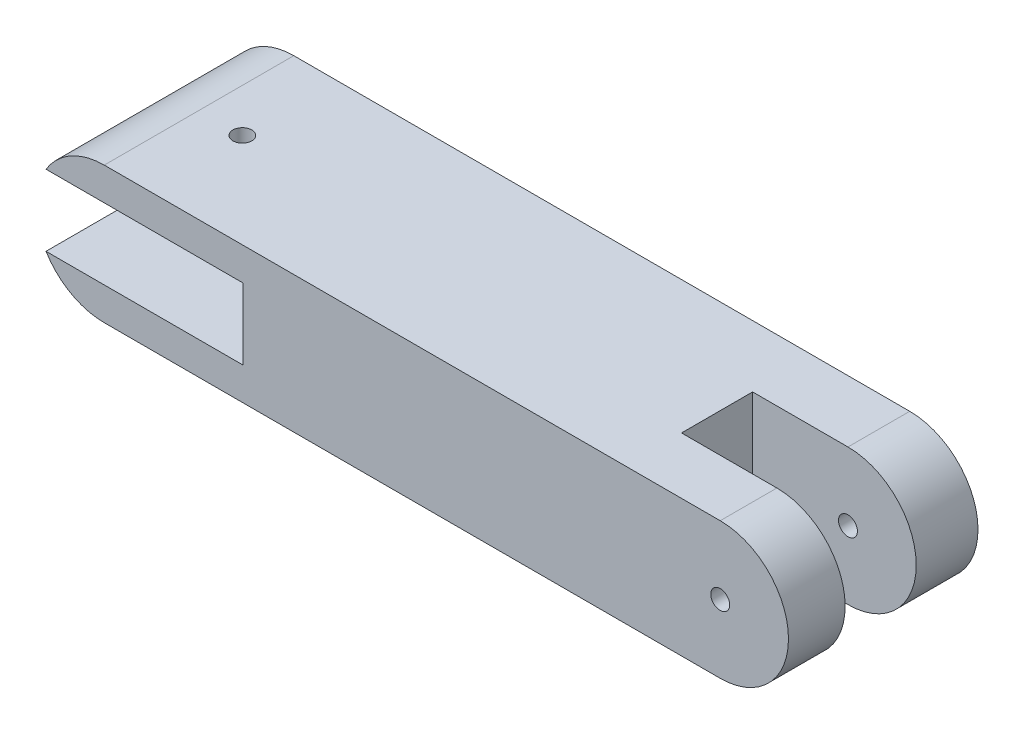
ISO-10303-21;
HEADER;
FILE_DESCRIPTION(('STEP AP214'),'2;1');
FILE_NAME('part.step','',(''),(''),'','','');
FILE_SCHEMA(('AUTOMOTIVE_DESIGN { 1 0 10303 214 1 1 1 1 }'));
ENDSEC;
DATA;
#1=APPLICATION_CONTEXT('core data for automotive mechanical design processes');
#2=APPLICATION_PROTOCOL_DEFINITION('international standard','automotive_design',2000,#1);
#3=PRODUCT_CONTEXT('',#1,'mechanical');
#4=PRODUCT('Part','Part','',(#3));
#5=PRODUCT_RELATED_PRODUCT_CATEGORY('part','',(#4));
#6=PRODUCT_DEFINITION_FORMATION('','',#4);
#7=PRODUCT_DEFINITION_CONTEXT('part definition',#1,'design');
#8=PRODUCT_DEFINITION('design','',#6,#7);
#9=PRODUCT_DEFINITION_SHAPE('','',#8);
#10=(LENGTH_UNIT() NAMED_UNIT(*) SI_UNIT(.MILLI.,.METRE.));
#11=(NAMED_UNIT(*) PLANE_ANGLE_UNIT() SI_UNIT($,.RADIAN.));
#12=(NAMED_UNIT(*) SI_UNIT($,.STERADIAN.) SOLID_ANGLE_UNIT());
#13=UNCERTAINTY_MEASURE_WITH_UNIT(LENGTH_MEASURE(1.E-05),#10,'distance_accuracy_value','');
#14=(GEOMETRIC_REPRESENTATION_CONTEXT(3) GLOBAL_UNCERTAINTY_ASSIGNED_CONTEXT((#13)) GLOBAL_UNIT_ASSIGNED_CONTEXT((#10,
#11,#12)) REPRESENTATION_CONTEXT('',''));
#15=CARTESIAN_POINT('',(0.,0.,0.));
#16=DIRECTION('',(0.,0.,1.));
#17=DIRECTION('',(1.,0.,0.));
#18=AXIS2_PLACEMENT_3D('',#15,#16,#17);
#19=CARTESIAN_POINT('',(73.4430865422729,0.,40.));
#20=DIRECTION('',(0.,0.,-1.));
#21=DIRECTION('',(-1.,0.,0.));
#22=AXIS2_PLACEMENT_3D('',#19,#20,#21);
#23=CYLINDRICAL_SURFACE('',#22,14.4058058925477);
#24=DIRECTION('',(0.,0.,-1.));
#25=VECTOR('',#24,1.);
#26=CARTESIAN_POINT('',(73.4430865422729,-14.4058058925477,40.));
#27=LINE('',#26,#25);
#28=CARTESIAN_POINT('',(73.4430865422729,-14.4058058925477,40.));
#29=VERTEX_POINT('',#28);
#30=CARTESIAN_POINT('',(73.4430865422729,-14.4058058925477,28.0405112287874));
#31=VERTEX_POINT('',#30);
#32=EDGE_CURVE('E247',#29,#31,#27,.T.);
#33=ORIENTED_EDGE('',*,*,#32,.T.);
#34=CARTESIAN_POINT('',(73.4430865422729,0.,28.0405112287874));
#35=DIRECTION('',(0.,0.,1.));
#36=DIRECTION('',(1.,0.,0.));
#37=AXIS2_PLACEMENT_3D('',#34,#35,#36);
#38=CIRCLE('',#37,14.4058058925477);
#39=CARTESIAN_POINT('',(73.4430865422729,14.4058058925477,28.0405112287874));
#40=VERTEX_POINT('',#39);
#41=EDGE_CURVE('E159',#31,#40,#38,.T.);
#42=ORIENTED_EDGE('',*,*,#41,.T.);
#43=DIRECTION('',(0.,0.,-1.));
#44=VECTOR('',#43,1.);
#45=CARTESIAN_POINT('',(73.4430865422729,14.4058058925477,40.));
#46=LINE('',#45,#44);
#47=CARTESIAN_POINT('',(73.4430865422729,14.4058058925477,40.));
#48=VERTEX_POINT('',#47);
#49=EDGE_CURVE('E260',#48,#40,#46,.T.);
#50=ORIENTED_EDGE('',*,*,#49,.F.);
#51=CARTESIAN_POINT('',(73.4430865422729,0.,40.));
#52=DIRECTION('',(0.,0.,1.));
#53=DIRECTION('',(-1.,0.,0.));
#54=AXIS2_PLACEMENT_3D('',#51,#52,#53);
#55=CIRCLE('',#54,14.4058058925477);
#56=EDGE_CURVE('E216',#29,#48,#55,.T.);
#57=ORIENTED_EDGE('',*,*,#56,.F.);
#58=EDGE_LOOP('',(#33,#42,#50,#57));
#59=FACE_BOUND('',#58,.T.);
#60=ADVANCED_FACE('F39',(#59),#23,.T.);
#61=CARTESIAN_POINT('',(73.4430865422729,0.,0.));
#62=DIRECTION('',(0.,0.,1.));
#63=DIRECTION('',(1.,0.,0.));
#64=AXIS2_PLACEMENT_3D('',#61,#62,#63);
#65=CYLINDRICAL_SURFACE('',#64,2.);
#66=CARTESIAN_POINT('',(73.4430865422729,0.,28.0405112287874));
#67=DIRECTION('',(0.,0.,1.));
#68=DIRECTION('',(1.,0.,0.));
#69=AXIS2_PLACEMENT_3D('',#66,#67,#68);
#70=CIRCLE('',#69,2.);
#71=CARTESIAN_POINT('',(75.4430865422729,0.,28.0405112287874));
#72=VERTEX_POINT('',#71);
#73=EDGE_CURVE('E136',#72,#72,#70,.F.);
#74=ORIENTED_EDGE('',*,*,#73,.T.);
#75=EDGE_LOOP('',(#74));
#76=FACE_BOUND('',#75,.T.);
#77=CARTESIAN_POINT('',(73.4430865422729,0.,40.));
#78=DIRECTION('',(0.,0.,-1.));
#79=DIRECTION('',(-1.,0.,0.));
#80=AXIS2_PLACEMENT_3D('',#77,#78,#79);
#81=CIRCLE('',#80,2.);
#82=CARTESIAN_POINT('',(71.4430865422729,0.,40.));
#83=VERTEX_POINT('',#82);
#84=EDGE_CURVE('E211',#83,#83,#81,.T.);
#85=ORIENTED_EDGE('',*,*,#84,.F.);
#86=EDGE_LOOP('',(#85));
#87=FACE_BOUND('',#86,.T.);
#88=ADVANCED_FACE('F320',(#76,#87),#65,.F.);
#89=CARTESIAN_POINT('',(-56.5569134577271,0.,40.));
#90=DIRECTION('',(0.,0.,-1.));
#91=DIRECTION('',(-1.,0.,0.));
#92=AXIS2_PLACEMENT_3D('',#89,#90,#91);
#93=CYLINDRICAL_SURFACE('',#92,14.4058058925477);
#94=CARTESIAN_POINT('',(-56.5569134577271,0.,0.));
#95=DIRECTION('',(0.,0.,1.));
#96=DIRECTION('',(-1.,0.,0.));
#97=AXIS2_PLACEMENT_3D('',#94,#95,#96);
#98=CIRCLE('',#97,14.4058058925477);
#99=CARTESIAN_POINT('',(-56.5569134577271,14.4058058925477,0.));
#100=VERTEX_POINT('',#99);
#101=CARTESIAN_POINT('',(-68.8563948863793,7.5,0.));
#102=VERTEX_POINT('',#101);
#103=EDGE_CURVE('E240',#100,#102,#98,.T.);
#104=ORIENTED_EDGE('',*,*,#103,.T.);
#105=DIRECTION('',(0.,0.,-1.));
#106=VECTOR('',#105,1.);
#107=CARTESIAN_POINT('',(-68.8563948863793,7.5,40.));
#108=LINE('',#107,#106);
#109=CARTESIAN_POINT('',(-68.8563948863793,7.5,40.));
#110=VERTEX_POINT('',#109);
#111=EDGE_CURVE('E203',#102,#110,#108,.F.);
#112=ORIENTED_EDGE('',*,*,#111,.T.);
#113=CARTESIAN_POINT('',(-56.5569134577271,0.,40.));
#114=DIRECTION('',(0.,0.,1.));
#115=DIRECTION('',(-1.,0.,0.));
#116=AXIS2_PLACEMENT_3D('',#113,#114,#115);
#117=CIRCLE('',#116,14.4058058925477);
#118=CARTESIAN_POINT('',(-56.5569134577271,14.4058058925477,40.));
#119=VERTEX_POINT('',#118);
#120=EDGE_CURVE('E225',#119,#110,#117,.T.);
#121=ORIENTED_EDGE('',*,*,#120,.F.);
#122=DIRECTION('',(0.,0.,-1.));
#123=VECTOR('',#122,1.);
#124=CARTESIAN_POINT('',(-56.5569134577271,14.4058058925477,40.));
#125=LINE('',#124,#123);
#126=EDGE_CURVE('E255',#119,#100,#125,.T.);
#127=ORIENTED_EDGE('',*,*,#126,.T.);
#128=EDGE_LOOP('',(#104,#112,#121,#127));
#129=FACE_BOUND('',#128,.T.);
#130=ADVANCED_FACE('F313',(#129),#93,.T.);
#131=CARTESIAN_POINT('',(73.4430865422729,14.4058058925477,13.0405112287874));
#132=VERTEX_POINT('',#131);
#133=CARTESIAN_POINT('',(73.4430865422729,14.4058058925477,0.));
#134=VERTEX_POINT('',#133);
#135=EDGE_CURVE('E259',#132,#134,#46,.T.);
#136=ORIENTED_EDGE('',*,*,#135,.F.);
#137=CARTESIAN_POINT('',(73.4430865422729,0.,13.0405112287874));
#138=DIRECTION('',(0.,0.,-1.));
#139=DIRECTION('',(-1.,0.,0.));
#140=AXIS2_PLACEMENT_3D('',#137,#138,#139);
#141=CIRCLE('',#140,14.4058058925477);
#142=CARTESIAN_POINT('',(73.4430865422729,-14.4058058925477,13.0405112287874));
#143=VERTEX_POINT('',#142);
#144=EDGE_CURVE('E131',#132,#143,#141,.T.);
#145=ORIENTED_EDGE('',*,*,#144,.T.);
#146=CARTESIAN_POINT('',(73.4430865422729,-14.4058058925477,0.));
#147=VERTEX_POINT('',#146);
#148=EDGE_CURVE('E232',#143,#147,#27,.T.);
#149=ORIENTED_EDGE('',*,*,#148,.T.);
#150=CARTESIAN_POINT('',(73.4430865422729,0.,0.));
#151=DIRECTION('',(0.,0.,1.));
#152=DIRECTION('',(-1.,0.,0.));
#153=AXIS2_PLACEMENT_3D('',#150,#151,#152);
#154=CIRCLE('',#153,14.4058058925477);
#155=EDGE_CURVE('E215',#147,#134,#154,.T.);
#156=ORIENTED_EDGE('',*,*,#155,.T.);
#157=EDGE_LOOP('',(#136,#145,#149,#156));
#158=FACE_BOUND('',#157,.T.);
#159=ADVANCED_FACE('F41',(#158),#23,.T.);
#160=CARTESIAN_POINT('',(-56.5569134577271,14.4058058925477,40.));
#161=DIRECTION('',(0.,-1.,0.));
#162=DIRECTION('',(0.,0.,-1.));
#163=AXIS2_PLACEMENT_3D('',#160,#161,#162);
#164=PLANE('',#163);
#165=CARTESIAN_POINT('',(-47.413412598644,14.4058058925477,20.));
#166=DIRECTION('',(0.,-1.,0.));
#167=DIRECTION('',(0.,0.,-1.));
#168=AXIS2_PLACEMENT_3D('',#165,#166,#167);
#169=CIRCLE('',#168,2.);
#170=CARTESIAN_POINT('',(-47.413412598644,14.4058058925477,18.));
#171=VERTEX_POINT('',#170);
#172=EDGE_CURVE('E170',#171,#171,#169,.T.);
#173=ORIENTED_EDGE('',*,*,#172,.T.);
#174=EDGE_LOOP('',(#173));
#175=FACE_BOUND('',#174,.T.);
#176=ORIENTED_EDGE('',*,*,#49,.T.);
#177=DIRECTION('',(-1.,0.,0.));
#178=VECTOR('',#177,1.);
#179=CARTESIAN_POINT('',(-56.5569134577271,14.4058058925477,28.0405112287874));
#180=LINE('',#179,#178);
#181=CARTESIAN_POINT('',(53.3181980301265,14.4058058925477,28.0405112287874));
#182=VERTEX_POINT('',#181);
#183=EDGE_CURVE('E150',#40,#182,#180,.T.);
#184=ORIENTED_EDGE('',*,*,#183,.T.);
#185=DIRECTION('',(0.,0.,-1.));
#186=VECTOR('',#185,1.);
#187=CARTESIAN_POINT('',(53.3181980301265,14.4058058925477,40.));
#188=LINE('',#187,#186);
#189=CARTESIAN_POINT('',(53.3181980301265,14.4058058925477,13.0405112287874));
#190=VERTEX_POINT('',#189);
#191=EDGE_CURVE('E141',#182,#190,#188,.T.);
#192=ORIENTED_EDGE('',*,*,#191,.T.);
#193=DIRECTION('',(1.,0.,0.));
#194=VECTOR('',#193,1.);
#195=CARTESIAN_POINT('',(-56.5569134577271,14.4058058925477,13.0405112287874));
#196=LINE('',#195,#194);
#197=EDGE_CURVE('E128',#190,#132,#196,.T.);
#198=ORIENTED_EDGE('',*,*,#197,.T.);
#199=ORIENTED_EDGE('',*,*,#135,.T.);
#200=DIRECTION('',(-1.,0.,0.));
#201=VECTOR('',#200,1.);
#202=CARTESIAN_POINT('',(-56.5569134577271,14.4058058925477,0.));
#203=LINE('',#202,#201);
#204=EDGE_CURVE('E236',#134,#100,#203,.T.);
#205=ORIENTED_EDGE('',*,*,#204,.T.);
#206=ORIENTED_EDGE('',*,*,#126,.F.);
#207=DIRECTION('',(-1.,0.,0.));
#208=VECTOR('',#207,1.);
#209=CARTESIAN_POINT('',(-56.5569134577271,14.4058058925477,40.));
#210=LINE('',#209,#208);
#211=EDGE_CURVE('E220',#48,#119,#210,.T.);
#212=ORIENTED_EDGE('',*,*,#211,.F.);
#213=EDGE_LOOP('',(#176,#184,#192,#198,#199,#205,#206,#212));
#214=FACE_BOUND('',#213,.T.);
#215=ADVANCED_FACE('F149',(#175,#214),#164,.F.);
#216=CARTESIAN_POINT('',(-68.8563948863793,-7.5,40.));
#217=VERTEX_POINT('',#216);
#218=CARTESIAN_POINT('',(-56.5569134577271,-14.4058058925477,40.));
#219=VERTEX_POINT('',#218);
#220=EDGE_CURVE('E224',#217,#219,#117,.T.);
#221=ORIENTED_EDGE('',*,*,#220,.F.);
#222=DIRECTION('',(0.,0.,-1.));
#223=VECTOR('',#222,1.);
#224=CARTESIAN_POINT('',(-68.8563948863793,-7.5,40.));
#225=LINE('',#224,#223);
#226=CARTESIAN_POINT('',(-68.8563948863793,-7.5,0.));
#227=VERTEX_POINT('',#226);
#228=EDGE_CURVE('E191',#217,#227,#225,.T.);
#229=ORIENTED_EDGE('',*,*,#228,.T.);
#230=CARTESIAN_POINT('',(-56.5569134577271,-14.4058058925477,0.));
#231=VERTEX_POINT('',#230);
#232=EDGE_CURVE('E239',#227,#231,#98,.T.);
#233=ORIENTED_EDGE('',*,*,#232,.T.);
#234=DIRECTION('',(0.,0.,-1.));
#235=VECTOR('',#234,1.);
#236=CARTESIAN_POINT('',(-56.5569134577271,-14.4058058925477,40.));
#237=LINE('',#236,#235);
#238=EDGE_CURVE('E251',#219,#231,#237,.T.);
#239=ORIENTED_EDGE('',*,*,#238,.F.);
#240=EDGE_LOOP('',(#221,#229,#233,#239));
#241=FACE_BOUND('',#240,.T.);
#242=ADVANCED_FACE('F302',(#241),#93,.T.);
#243=CARTESIAN_POINT('',(-56.5569134577271,-14.4058058925477,40.));
#244=DIRECTION('',(0.,1.,0.));
#245=DIRECTION('',(0.,0.,1.));
#246=AXIS2_PLACEMENT_3D('',#243,#244,#245);
#247=PLANE('',#246);
#248=CARTESIAN_POINT('',(-47.413412598644,-14.4058058925477,20.));
#249=DIRECTION('',(0.,1.,0.));
#250=DIRECTION('',(0.,0.,1.));
#251=AXIS2_PLACEMENT_3D('',#248,#249,#250);
#252=CIRCLE('',#251,2.);
#253=CARTESIAN_POINT('',(-47.413412598644,-14.4058058925477,22.));
#254=VERTEX_POINT('',#253);
#255=EDGE_CURVE('E166',#254,#254,#252,.T.);
#256=ORIENTED_EDGE('',*,*,#255,.T.);
#257=EDGE_LOOP('',(#256));
#258=FACE_BOUND('',#257,.T.);
#259=DIRECTION('',(0.,0.,1.));
#260=VECTOR('',#259,1.);
#261=CARTESIAN_POINT('',(53.3181980301265,-14.4058058925477,40.));
#262=LINE('',#261,#260);
#263=CARTESIAN_POINT('',(53.3181980301265,-14.4058058925477,13.0405112287874));
#264=VERTEX_POINT('',#263);
#265=CARTESIAN_POINT('',(53.3181980301265,-14.4058058925477,28.0405112287874));
#266=VERTEX_POINT('',#265);
#267=EDGE_CURVE('E11',#264,#266,#262,.T.);
#268=ORIENTED_EDGE('',*,*,#267,.T.);
#269=DIRECTION('',(1.,0.,0.));
#270=VECTOR('',#269,1.);
#271=CARTESIAN_POINT('',(-56.5569134577271,-14.4058058925477,28.0405112287874));
#272=LINE('',#271,#270);
#273=EDGE_CURVE('E271',#266,#31,#272,.T.);
#274=ORIENTED_EDGE('',*,*,#273,.T.);
#275=ORIENTED_EDGE('',*,*,#32,.F.);
#276=DIRECTION('',(1.,0.,0.));
#277=VECTOR('',#276,1.);
#278=CARTESIAN_POINT('',(-56.5569134577271,-14.4058058925477,40.));
#279=LINE('',#278,#277);
#280=EDGE_CURVE('E229',#219,#29,#279,.T.);
#281=ORIENTED_EDGE('',*,*,#280,.F.);
#282=ORIENTED_EDGE('',*,*,#238,.T.);
#283=DIRECTION('',(1.,0.,0.));
#284=VECTOR('',#283,1.);
#285=CARTESIAN_POINT('',(-56.5569134577271,-14.4058058925477,0.));
#286=LINE('',#285,#284);
#287=EDGE_CURVE('E221',#231,#147,#286,.T.);
#288=ORIENTED_EDGE('',*,*,#287,.T.);
#289=ORIENTED_EDGE('',*,*,#148,.F.);
#290=DIRECTION('',(-1.,0.,0.));
#291=VECTOR('',#290,1.);
#292=CARTESIAN_POINT('',(-56.5569134577271,-14.4058058925477,13.0405112287874));
#293=LINE('',#292,#291);
#294=EDGE_CURVE('E268',#143,#264,#293,.T.);
#295=ORIENTED_EDGE('',*,*,#294,.T.);
#296=EDGE_LOOP('',(#268,#274,#275,#281,#282,#288,#289,#295));
#297=FACE_BOUND('',#296,.T.);
#298=ADVANCED_FACE('F289',(#258,#297),#247,.F.);
#299=CARTESIAN_POINT('',(73.4430865422729,0.,40.));
#300=DIRECTION('',(0.,0.,-1.));
#301=DIRECTION('',(-1.,0.,0.));
#302=AXIS2_PLACEMENT_3D('',#299,#300,#301);
#303=PLANE('',#302);
#304=ORIENTED_EDGE('',*,*,#84,.T.);
#305=EDGE_LOOP('',(#304));
#306=FACE_BOUND('',#305,.T.);
#307=ORIENTED_EDGE('',*,*,#120,.T.);
#308=DIRECTION('',(1.,0.,0.));
#309=VECTOR('',#308,1.);
#310=CARTESIAN_POINT('',(73.4430865422729,7.5,40.));
#311=LINE('',#310,#309);
#312=CARTESIAN_POINT('',(-27.3238821856933,7.5,40.));
#313=VERTEX_POINT('',#312);
#314=EDGE_CURVE('E199',#110,#313,#311,.T.);
#315=ORIENTED_EDGE('',*,*,#314,.T.);
#316=DIRECTION('',(0.,-1.,0.));
#317=VECTOR('',#316,1.);
#318=CARTESIAN_POINT('',(-27.3238821856933,0.,40.));
#319=LINE('',#318,#317);
#320=CARTESIAN_POINT('',(-27.3238821856933,-7.5,40.));
#321=VERTEX_POINT('',#320);
#322=EDGE_CURVE('E195',#313,#321,#319,.T.);
#323=ORIENTED_EDGE('',*,*,#322,.T.);
#324=DIRECTION('',(-1.,0.,0.));
#325=VECTOR('',#324,1.);
#326=CARTESIAN_POINT('',(73.4430865422729,-7.5,40.));
#327=LINE('',#326,#325);
#328=EDGE_CURVE('E185',#321,#217,#327,.T.);
#329=ORIENTED_EDGE('',*,*,#328,.T.);
#330=ORIENTED_EDGE('',*,*,#220,.T.);
#331=ORIENTED_EDGE('',*,*,#280,.T.);
#332=ORIENTED_EDGE('',*,*,#56,.T.);
#333=ORIENTED_EDGE('',*,*,#211,.T.);
#334=EDGE_LOOP('',(#307,#315,#323,#329,#330,#331,#332,#333));
#335=FACE_BOUND('',#334,.T.);
#336=ADVANCED_FACE('F315',(#306,#335),#303,.F.);
#337=CARTESIAN_POINT('',(73.4430865422729,0.,0.));
#338=DIRECTION('',(0.,0.,-1.));
#339=DIRECTION('',(-1.,0.,0.));
#340=AXIS2_PLACEMENT_3D('',#337,#338,#339);
#341=PLANE('',#340);
#342=DIRECTION('',(-1.,0.,0.));
#343=VECTOR('',#342,1.);
#344=CARTESIAN_POINT('',(-27.3238821856933,7.5,0.));
#345=LINE('',#344,#343);
#346=CARTESIAN_POINT('',(-27.3238821856933,7.5,0.));
#347=VERTEX_POINT('',#346);
#348=EDGE_CURVE('E176',#347,#102,#345,.T.);
#349=ORIENTED_EDGE('',*,*,#348,.T.);
#350=ORIENTED_EDGE('',*,*,#103,.F.);
#351=ORIENTED_EDGE('',*,*,#204,.F.);
#352=ORIENTED_EDGE('',*,*,#155,.F.);
#353=ORIENTED_EDGE('',*,*,#287,.F.);
#354=ORIENTED_EDGE('',*,*,#232,.F.);
#355=DIRECTION('',(-1.,0.,0.));
#356=VECTOR('',#355,1.);
#357=CARTESIAN_POINT('',(73.4430865422729,-7.5,0.));
#358=LINE('',#357,#356);
#359=CARTESIAN_POINT('',(-27.3238821856933,-7.5,0.));
#360=VERTEX_POINT('',#359);
#361=EDGE_CURVE('E48',#360,#227,#358,.T.);
#362=ORIENTED_EDGE('',*,*,#361,.F.);
#363=DIRECTION('',(0.,1.,0.));
#364=VECTOR('',#363,1.);
#365=CARTESIAN_POINT('',(-27.3238821856933,7.5,0.));
#366=LINE('',#365,#364);
#367=EDGE_CURVE('E63',#360,#347,#366,.T.);
#368=ORIENTED_EDGE('',*,*,#367,.T.);
#369=EDGE_LOOP('',(#349,#350,#351,#352,#353,#354,#362,#368));
#370=FACE_BOUND('',#369,.T.);
#371=CARTESIAN_POINT('',(73.4430865422729,0.,0.));
#372=DIRECTION('',(0.,0.,1.));
#373=DIRECTION('',(1.,0.,0.));
#374=AXIS2_PLACEMENT_3D('',#371,#372,#373);
#375=CIRCLE('',#374,2.);
#376=CARTESIAN_POINT('',(75.4430865422729,0.,0.));
#377=VERTEX_POINT('',#376);
#378=EDGE_CURVE('E207',#377,#377,#375,.T.);
#379=ORIENTED_EDGE('',*,*,#378,.T.);
#380=EDGE_LOOP('',(#379));
#381=FACE_BOUND('',#380,.T.);
#382=ADVANCED_FACE('F307',(#370,#381),#341,.T.);
#383=CARTESIAN_POINT('',(73.4430865422729,0.,13.0405112287874));
#384=DIRECTION('',(0.,0.,-1.));
#385=DIRECTION('',(-1.,0.,0.));
#386=AXIS2_PLACEMENT_3D('',#383,#384,#385);
#387=CIRCLE('',#386,2.);
#388=CARTESIAN_POINT('',(71.4430865422729,0.,13.0405112287874));
#389=VERTEX_POINT('',#388);
#390=EDGE_CURVE('E265',#389,#389,#387,.F.);
#391=ORIENTED_EDGE('',*,*,#390,.T.);
#392=EDGE_LOOP('',(#391));
#393=FACE_BOUND('',#392,.T.);
#394=ORIENTED_EDGE('',*,*,#378,.F.);
#395=EDGE_LOOP('',(#394));
#396=FACE_BOUND('',#395,.T.);
#397=ADVANCED_FACE('F325',(#393,#396),#65,.F.);
#398=CARTESIAN_POINT('',(-27.3238821856933,7.5,0.));
#399=DIRECTION('',(0.,1.,0.));
#400=DIRECTION('',(0.,0.,1.));
#401=AXIS2_PLACEMENT_3D('',#398,#399,#400);
#402=PLANE('',#401);
#403=CARTESIAN_POINT('',(-47.413412598644,7.5,20.));
#404=DIRECTION('',(0.,1.,0.));
#405=DIRECTION('',(0.,0.,1.));
#406=AXIS2_PLACEMENT_3D('',#403,#404,#405);
#407=CIRCLE('',#406,2.);
#408=CARTESIAN_POINT('',(-47.413412598644,7.5,22.));
#409=VERTEX_POINT('',#408);
#410=EDGE_CURVE('E157',#409,#409,#407,.T.);
#411=ORIENTED_EDGE('',*,*,#410,.T.);
#412=EDGE_LOOP('',(#411));
#413=FACE_BOUND('',#412,.T.);
#414=ORIENTED_EDGE('',*,*,#348,.F.);
#415=DIRECTION('',(0.,0.,1.));
#416=VECTOR('',#415,1.);
#417=CARTESIAN_POINT('',(-27.3238821856933,7.5,0.));
#418=LINE('',#417,#416);
#419=EDGE_CURVE('E181',#347,#313,#418,.T.);
#420=ORIENTED_EDGE('',*,*,#419,.T.);
#421=ORIENTED_EDGE('',*,*,#314,.F.);
#422=ORIENTED_EDGE('',*,*,#111,.F.);
#423=EDGE_LOOP('',(#414,#420,#421,#422));
#424=FACE_BOUND('',#423,.T.);
#425=ADVANCED_FACE('F350',(#413,#424),#402,.F.);
#426=CARTESIAN_POINT('',(-27.3238821856933,7.5,0.));
#427=DIRECTION('',(1.,0.,0.));
#428=DIRECTION('',(0.,0.,-1.));
#429=AXIS2_PLACEMENT_3D('',#426,#427,#428);
#430=PLANE('',#429);
#431=ORIENTED_EDGE('',*,*,#419,.F.);
#432=ORIENTED_EDGE('',*,*,#367,.F.);
#433=DIRECTION('',(0.,0.,1.));
#434=VECTOR('',#433,1.);
#435=CARTESIAN_POINT('',(-27.3238821856933,-7.5,0.));
#436=LINE('',#435,#434);
#437=EDGE_CURVE('E180',#360,#321,#436,.T.);
#438=ORIENTED_EDGE('',*,*,#437,.T.);
#439=ORIENTED_EDGE('',*,*,#322,.F.);
#440=EDGE_LOOP('',(#431,#432,#438,#439));
#441=FACE_BOUND('',#440,.T.);
#442=ADVANCED_FACE('F356',(#441),#430,.F.);
#443=CARTESIAN_POINT('',(-27.3238821856933,-7.5,0.));
#444=DIRECTION('',(0.,-1.,0.));
#445=DIRECTION('',(0.,0.,-1.));
#446=AXIS2_PLACEMENT_3D('',#443,#444,#445);
#447=PLANE('',#446);
#448=CARTESIAN_POINT('',(-47.413412598644,-7.5,20.));
#449=DIRECTION('',(0.,-1.,0.));
#450=DIRECTION('',(0.,0.,-1.));
#451=AXIS2_PLACEMENT_3D('',#448,#449,#450);
#452=CIRCLE('',#451,2.);
#453=CARTESIAN_POINT('',(-47.413412598644,-7.5,18.));
#454=VERTEX_POINT('',#453);
#455=EDGE_CURVE('E152',#454,#454,#452,.T.);
#456=ORIENTED_EDGE('',*,*,#455,.T.);
#457=EDGE_LOOP('',(#456));
#458=FACE_BOUND('',#457,.T.);
#459=ORIENTED_EDGE('',*,*,#328,.F.);
#460=ORIENTED_EDGE('',*,*,#437,.F.);
#461=ORIENTED_EDGE('',*,*,#361,.T.);
#462=ORIENTED_EDGE('',*,*,#228,.F.);
#463=EDGE_LOOP('',(#459,#460,#461,#462));
#464=FACE_BOUND('',#463,.T.);
#465=ADVANCED_FACE('F352',(#458,#464),#447,.F.);
#466=CARTESIAN_POINT('',(-47.413412598644,-25.5941941074523,20.));
#467=DIRECTION('',(0.,1.,0.));
#468=DIRECTION('',(0.,0.,1.));
#469=AXIS2_PLACEMENT_3D('',#466,#467,#468);
#470=CYLINDRICAL_SURFACE('',#469,2.);
#471=ORIENTED_EDGE('',*,*,#455,.F.);
#472=EDGE_LOOP('',(#471));
#473=FACE_BOUND('',#472,.T.);
#474=ORIENTED_EDGE('',*,*,#255,.F.);
#475=EDGE_LOOP('',(#474));
#476=FACE_BOUND('',#475,.T.);
#477=ADVANCED_FACE('F355',(#473,#476),#470,.F.);
#478=ORIENTED_EDGE('',*,*,#410,.F.);
#479=EDGE_LOOP('',(#478));
#480=FACE_BOUND('',#479,.T.);
#481=ORIENTED_EDGE('',*,*,#172,.F.);
#482=EDGE_LOOP('',(#481));
#483=FACE_BOUND('',#482,.T.);
#484=ADVANCED_FACE('F363',(#480,#483),#470,.F.);
#485=CARTESIAN_POINT('',(53.3181980301265,-48.0941941074523,13.0405112287874));
#486=DIRECTION('',(-1.,0.,0.));
#487=DIRECTION('',(0.,0.,1.));
#488=AXIS2_PLACEMENT_3D('',#485,#486,#487);
#489=PLANE('',#488);
#490=DIRECTION('',(0.,1.,0.));
#491=VECTOR('',#490,1.);
#492=CARTESIAN_POINT('',(53.3181980301265,-48.0941941074523,28.0405112287874));
#493=LINE('',#492,#491);
#494=EDGE_CURVE('E145',#266,#182,#493,.T.);
#495=ORIENTED_EDGE('',*,*,#494,.F.);
#496=ORIENTED_EDGE('',*,*,#267,.F.);
#497=DIRECTION('',(0.,1.,0.));
#498=VECTOR('',#497,1.);
#499=CARTESIAN_POINT('',(53.3181980301265,-48.0941941074523,13.0405112287874));
#500=LINE('',#499,#498);
#501=EDGE_CURVE('E55',#264,#190,#500,.T.);
#502=ORIENTED_EDGE('',*,*,#501,.T.);
#503=ORIENTED_EDGE('',*,*,#191,.F.);
#504=EDGE_LOOP('',(#495,#496,#502,#503));
#505=FACE_BOUND('',#504,.T.);
#506=ADVANCED_FACE('F140',(#505),#489,.F.);
#507=CARTESIAN_POINT('',(53.3181980301265,-48.0941941074523,28.0405112287874));
#508=DIRECTION('',(0.,0.,1.));
#509=DIRECTION('',(1.,0.,0.));
#510=AXIS2_PLACEMENT_3D('',#507,#508,#509);
#511=PLANE('',#510);
#512=ORIENTED_EDGE('',*,*,#73,.F.);
#513=EDGE_LOOP('',(#512));
#514=FACE_BOUND('',#513,.T.);
#515=ORIENTED_EDGE('',*,*,#41,.F.);
#516=ORIENTED_EDGE('',*,*,#273,.F.);
#517=ORIENTED_EDGE('',*,*,#494,.T.);
#518=ORIENTED_EDGE('',*,*,#183,.F.);
#519=EDGE_LOOP('',(#515,#516,#517,#518));
#520=FACE_BOUND('',#519,.T.);
#521=ADVANCED_FACE('F288',(#514,#520),#511,.F.);
#522=CARTESIAN_POINT('',(53.3181980301265,-48.0941941074523,13.0405112287874));
#523=DIRECTION('',(0.,0.,-1.));
#524=DIRECTION('',(-1.,0.,0.));
#525=AXIS2_PLACEMENT_3D('',#522,#523,#524);
#526=PLANE('',#525);
#527=ORIENTED_EDGE('',*,*,#390,.F.);
#528=EDGE_LOOP('',(#527));
#529=FACE_BOUND('',#528,.T.);
#530=ORIENTED_EDGE('',*,*,#501,.F.);
#531=ORIENTED_EDGE('',*,*,#294,.F.);
#532=ORIENTED_EDGE('',*,*,#144,.F.);
#533=ORIENTED_EDGE('',*,*,#197,.F.);
#534=EDGE_LOOP('',(#530,#531,#532,#533));
#535=FACE_BOUND('',#534,.T.);
#536=ADVANCED_FACE('F129',(#529,#535),#526,.F.);
#537=CLOSED_SHELL('',(#60,#88,#130,#159,#215,#242,#298,#336,#382,#397,#425,#442,#465,#477,#484,
#506,#521,#536));
#538=MANIFOLD_SOLID_BREP('B2',#537);
#539=ADVANCED_BREP_SHAPE_REPRESENTATION('',(#18,#538),#14);
#540=SHAPE_DEFINITION_REPRESENTATION(#9,#539);
ENDSEC;
END-ISO-10303-21;
